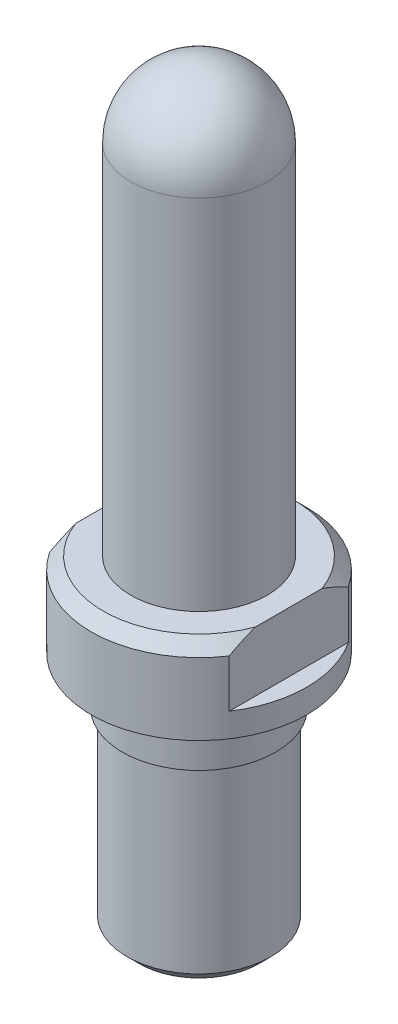
ISO-10303-21;
HEADER;
FILE_DESCRIPTION(('STEP AP214'),'2;1');
FILE_NAME('part.step','',(''),(''),'','','');
FILE_SCHEMA(('AUTOMOTIVE_DESIGN { 1 0 10303 214 1 1 1 1 }'));
ENDSEC;
DATA;
#1=APPLICATION_CONTEXT('core data for automotive mechanical design processes');
#2=APPLICATION_PROTOCOL_DEFINITION('international standard','automotive_design',2000,#1);
#3=PRODUCT_CONTEXT('',#1,'mechanical');
#4=PRODUCT('Part','Part','',(#3));
#5=PRODUCT_RELATED_PRODUCT_CATEGORY('part','',(#4));
#6=PRODUCT_DEFINITION_FORMATION('','',#4);
#7=PRODUCT_DEFINITION_CONTEXT('part definition',#1,'design');
#8=PRODUCT_DEFINITION('design','',#6,#7);
#9=PRODUCT_DEFINITION_SHAPE('','',#8);
#10=(LENGTH_UNIT() NAMED_UNIT(*) SI_UNIT(.MILLI.,.METRE.));
#11=(NAMED_UNIT(*) PLANE_ANGLE_UNIT() SI_UNIT($,.RADIAN.));
#12=(NAMED_UNIT(*) SI_UNIT($,.STERADIAN.) SOLID_ANGLE_UNIT());
#13=UNCERTAINTY_MEASURE_WITH_UNIT(LENGTH_MEASURE(1.E-05),#10,'distance_accuracy_value','');
#14=(GEOMETRIC_REPRESENTATION_CONTEXT(3) GLOBAL_UNCERTAINTY_ASSIGNED_CONTEXT((#13)) GLOBAL_UNIT_ASSIGNED_CONTEXT((#10,
#11,#12)) REPRESENTATION_CONTEXT('',''));
#15=CARTESIAN_POINT('',(0.,0.,0.));
#16=DIRECTION('',(0.,0.,1.));
#17=DIRECTION('',(1.,0.,0.));
#18=AXIS2_PLACEMENT_3D('',#15,#16,#17);
#19=CARTESIAN_POINT('',(2.85,13.5,0.));
#20=DIRECTION('',(0.,1.,0.));
#21=DIRECTION('',(-1.,0.,0.));
#22=AXIS2_PLACEMENT_3D('',#19,#20,#21);
#23=PLANE('',#22);
#24=CARTESIAN_POINT('',(0.,13.5,0.));
#25=DIRECTION('',(0.,-1.,0.));
#26=DIRECTION('',(1.,0.,0.));
#27=AXIS2_PLACEMENT_3D('',#24,#25,#26);
#28=CIRCLE('',#27,2.85);
#29=CARTESIAN_POINT('',(2.85,13.5,0.));
#30=VERTEX_POINT('',#29);
#31=EDGE_CURVE('E217',#30,#30,#28,.T.);
#32=ORIENTED_EDGE('',*,*,#31,.T.);
#33=EDGE_LOOP('',(#32));
#34=FACE_BOUND('',#33,.T.);
#35=CARTESIAN_POINT('',(0.,13.5,0.));
#36=DIRECTION('',(0.,-1.,0.));
#37=DIRECTION('',(1.,0.,0.));
#38=AXIS2_PLACEMENT_3D('',#35,#36,#37);
#39=CIRCLE('',#38,4.);
#40=CARTESIAN_POINT('',(3.75,13.5,1.3919410907075));
#41=VERTEX_POINT('',#40);
#42=CARTESIAN_POINT('',(-3.75,13.5,1.39194109070749));
#43=VERTEX_POINT('',#42);
#44=EDGE_CURVE('E213',#41,#43,#39,.T.);
#45=ORIENTED_EDGE('',*,*,#44,.F.);
#46=DIRECTION('',(0.,0.,-1.));
#47=VECTOR('',#46,1.);
#48=CARTESIAN_POINT('',(3.75,13.5,0.));
#49=LINE('',#48,#47);
#50=CARTESIAN_POINT('',(3.75,13.5,-1.3919410907075));
#51=VERTEX_POINT('',#50);
#52=EDGE_CURVE('E234',#41,#51,#49,.T.);
#53=ORIENTED_EDGE('',*,*,#52,.T.);
#54=CARTESIAN_POINT('',(-3.75,13.5,-1.3919410907075));
#55=VERTEX_POINT('',#54);
#56=EDGE_CURVE('E214',#55,#51,#39,.T.);
#57=ORIENTED_EDGE('',*,*,#56,.F.);
#58=DIRECTION('',(0.,0.,-1.));
#59=VECTOR('',#58,1.);
#60=CARTESIAN_POINT('',(-3.75,13.5,0.));
#61=LINE('',#60,#59);
#62=EDGE_CURVE('E194',#43,#55,#61,.T.);
#63=ORIENTED_EDGE('',*,*,#62,.F.);
#64=EDGE_LOOP('',(#45,#53,#57,#63));
#65=FACE_BOUND('',#64,.T.);
#66=ADVANCED_FACE('F43',(#34,#65),#23,.T.);
#67=CARTESIAN_POINT('',(0.,13.,0.));
#68=DIRECTION('',(0.,-1.,0.));
#69=DIRECTION('',(1.,0.,0.));
#70=AXIS2_PLACEMENT_3D('',#67,#68,#69);
#71=CONICAL_SURFACE('',#70,4.5,0.785398163397448);
#72=CARTESIAN_POINT('',(0.,13.,0.));
#73=DIRECTION('',(0.,-1.,0.));
#74=DIRECTION('',(1.,0.,0.));
#75=AXIS2_PLACEMENT_3D('',#72,#73,#74);
#76=CIRCLE('',#75,4.5);
#77=CARTESIAN_POINT('',(3.75,13.,2.48746859276654));
#78=VERTEX_POINT('',#77);
#79=CARTESIAN_POINT('',(-3.75,13.,2.48746859276654));
#80=VERTEX_POINT('',#79);
#81=EDGE_CURVE('E210',#78,#80,#76,.T.);
#82=ORIENTED_EDGE('',*,*,#81,.F.);
#83=CARTESIAN_POINT('',(3.75,12.9993,2.48873471667833));
#84=CARTESIAN_POINT('',(3.75,13.0361817878737,2.42202912551067));
#85=CARTESIAN_POINT('',(3.75,13.0722813669249,2.35489184848555));
#86=CARTESIAN_POINT('',(3.75,13.1426985759603,2.21966577046416));
#87=CARTESIAN_POINT('',(3.75,13.1770156895048,2.15157670087398));
#88=CARTESIAN_POINT('',(3.75,13.2771910671215,1.94528129073575));
#89=CARTESIAN_POINT('',(3.75,13.3399867655357,1.80555758382075));
#90=CARTESIAN_POINT('',(3.75,13.4555959672474,1.52047067940305));
#91=CARTESIAN_POINT('',(3.75,13.5083110982389,1.37506709026111));
#92=CARTESIAN_POINT('',(3.75,13.6000446020621,1.08014165505694));
#93=CARTESIAN_POINT('',(3.75,13.639084634821,0.930626729815602));
#94=CARTESIAN_POINT('',(3.75,13.6923169926107,0.669057776537484));
#95=CARTESIAN_POINT('',(3.75,13.710372251948,0.557789767388917));
#96=CARTESIAN_POINT('',(3.75,13.7367851685326,0.33407963464614));
#97=CARTESIAN_POINT('',(3.75,13.745142422067,0.221637462369944));
#98=CARTESIAN_POINT('',(3.75,13.7516668167818,-0.00284049045372767));
#99=CARTESIAN_POINT('',(3.75,13.7498975051341,-0.114874400269739));
#100=CARTESIAN_POINT('',(3.75,13.7364216972624,-0.338335407266132));
#101=CARTESIAN_POINT('',(3.75,13.7247145875436,-0.449762466556107));
#102=CARTESIAN_POINT('',(3.75,13.6878776753174,-0.698932729474216));
#103=CARTESIAN_POINT('',(3.75,13.6601231666735,-0.836287951821978));
#104=CARTESIAN_POINT('',(3.75,13.5919991886846,-1.10783345550892));
#105=CARTESIAN_POINT('',(3.75,13.5516230759018,-1.24202202997151));
#106=CARTESIAN_POINT('',(3.75,13.4602797534377,-1.50746827490967));
#107=CARTESIAN_POINT('',(3.75,13.4092586979175,-1.63870713408834));
#108=CARTESIAN_POINT('',(3.75,13.2988722991081,-1.89754675398007));
#109=CARTESIAN_POINT('',(3.75,13.2395092483229,-2.02514850267544));
#110=CARTESIAN_POINT('',(3.75,13.1484498499109,-2.20815164090106));
#111=CARTESIAN_POINT('',(3.75,13.1193746410524,-2.264879932212));
#112=CARTESIAN_POINT('',(3.75,13.0601435688905,-2.37741466162818));
#113=CARTESIAN_POINT('',(3.75,13.0299937111983,-2.43322425806078));
#114=CARTESIAN_POINT('',(3.75,12.9993,-2.48873471667834));
#115=B_SPLINE_CURVE_WITH_KNOTS('',3,(#83,#84,#85,#86,#87,#88,#89,#90,#91,#92,#93,#94,#95,#96,
#97,#98,#99,#100,#101,#102,#103,#104,#105,#106,#107,#108,#109,#110,#111,#112,#113,#114),
.UNSPECIFIED.,.F.,.F.,(4,2,2,2,2,2,2,2,2,2,2,2,2,2,2,4),(0.,0.228658109489232,0.457382103483036,
0.916584890329266,1.38006265677654,1.84280296769301,2.18059459443575,2.51840028241008,
2.85408847417469,3.18979739064798,3.60946579834014,4.02935547337484,4.45142295671228,
4.8733746756542,5.06459957862342,5.25488575630083),.UNSPECIFIED.);
#116=EDGE_CURVE('E98',#78,#41,#115,.T.);
#117=ORIENTED_EDGE('',*,*,#116,.T.);
#118=ORIENTED_EDGE('',*,*,#44,.T.);
#119=CARTESIAN_POINT('',(-3.75,12.9993,2.48873471667833));
#120=CARTESIAN_POINT('',(-3.75,13.0361817878737,2.42202912551067));
#121=CARTESIAN_POINT('',(-3.75,13.0722813669249,2.35489184848555));
#122=CARTESIAN_POINT('',(-3.75,13.1426985759603,2.21966577046416));
#123=CARTESIAN_POINT('',(-3.75,13.1770156895048,2.15157670087398));
#124=CARTESIAN_POINT('',(-3.75,13.2771910671215,1.94528129073575));
#125=CARTESIAN_POINT('',(-3.75,13.3399867655357,1.80555758382075));
#126=CARTESIAN_POINT('',(-3.75,13.4555959672474,1.52047067940305));
#127=CARTESIAN_POINT('',(-3.75,13.5083110982389,1.37506709026111));
#128=CARTESIAN_POINT('',(-3.75,13.6000446020621,1.08014165505694));
#129=CARTESIAN_POINT('',(-3.75,13.639084634821,0.930626729815602));
#130=CARTESIAN_POINT('',(-3.75,13.6923169926107,0.669057776537484));
#131=CARTESIAN_POINT('',(-3.75,13.710372251948,0.557789767388917));
#132=CARTESIAN_POINT('',(-3.75,13.7367851685326,0.33407963464614));
#133=CARTESIAN_POINT('',(-3.75,13.745142422067,0.221637462369944));
#134=CARTESIAN_POINT('',(-3.75,13.7516668167818,-0.00284049045372767));
#135=CARTESIAN_POINT('',(-3.75,13.7498975051341,-0.114874400269739));
#136=CARTESIAN_POINT('',(-3.75,13.7364216972624,-0.338335407266132));
#137=CARTESIAN_POINT('',(-3.75,13.7247145875436,-0.449762466556107));
#138=CARTESIAN_POINT('',(-3.75,13.6878776753174,-0.698932729474216));
#139=CARTESIAN_POINT('',(-3.75,13.6601231666735,-0.836287951821978));
#140=CARTESIAN_POINT('',(-3.75,13.5919991886846,-1.10783345550892));
#141=CARTESIAN_POINT('',(-3.75,13.5516230759018,-1.24202202997151));
#142=CARTESIAN_POINT('',(-3.75,13.4602797534377,-1.50746827490967));
#143=CARTESIAN_POINT('',(-3.75,13.4092586979175,-1.63870713408834));
#144=CARTESIAN_POINT('',(-3.75,13.2988722991081,-1.89754675398007));
#145=CARTESIAN_POINT('',(-3.75,13.2395092483229,-2.02514850267544));
#146=CARTESIAN_POINT('',(-3.75,13.1484498499109,-2.20815164090106));
#147=CARTESIAN_POINT('',(-3.75,13.1193746410524,-2.264879932212));
#148=CARTESIAN_POINT('',(-3.75,13.0601435688905,-2.37741466162818));
#149=CARTESIAN_POINT('',(-3.75,13.0299937111983,-2.43322425806078));
#150=CARTESIAN_POINT('',(-3.75,12.9993,-2.48873471667834));
#151=B_SPLINE_CURVE_WITH_KNOTS('',3,(#119,#120,#121,#122,#123,#124,#125,#126,#127,#128,#129,
#130,#131,#132,#133,#134,#135,#136,#137,#138,#139,#140,#141,#142,#143,#144,#145,#146,#147,#148,
#149,#150),.UNSPECIFIED.,.F.,.F.,(4,2,2,2,2,2,2,2,2,2,2,2,2,2,2,4),(0.,0.228658109489232,
0.457382103483036,0.916584890329266,1.38006265677654,1.84280296769301,2.18059459443575,
2.51840028241008,2.85408847417469,3.18979739064798,3.60946579834014,4.02935547337484,
4.45142295671228,4.8733746756542,5.06459957862342,5.25488575630083),.UNSPECIFIED.);
#152=EDGE_CURVE('E195',#80,#43,#151,.T.);
#153=ORIENTED_EDGE('',*,*,#152,.F.);
#154=EDGE_LOOP('',(#82,#117,#118,#153));
#155=FACE_BOUND('',#154,.T.);
#156=ADVANCED_FACE('F129',(#155),#71,.T.);
#157=ORIENTED_EDGE('',*,*,#56,.T.);
#158=CARTESIAN_POINT('',(3.75,13.,-2.48746859276655));
#159=VERTEX_POINT('',#158);
#160=EDGE_CURVE('E107',#51,#159,#115,.T.);
#161=ORIENTED_EDGE('',*,*,#160,.T.);
#162=CARTESIAN_POINT('',(-3.75,13.,-2.48746859276655));
#163=VERTEX_POINT('',#162);
#164=EDGE_CURVE('E211',#163,#159,#76,.T.);
#165=ORIENTED_EDGE('',*,*,#164,.F.);
#166=EDGE_CURVE('E187',#55,#163,#151,.T.);
#167=ORIENTED_EDGE('',*,*,#166,.F.);
#168=EDGE_LOOP('',(#157,#161,#165,#167));
#169=FACE_BOUND('',#168,.T.);
#170=ADVANCED_FACE('F135',(#169),#71,.T.);
#171=CARTESIAN_POINT('',(0.,0.,0.));
#172=DIRECTION('',(0.,-1.,0.));
#173=DIRECTION('',(1.,0.,0.));
#174=AXIS2_PLACEMENT_3D('',#171,#172,#173);
#175=CYLINDRICAL_SURFACE('',#174,4.5);
#176=CARTESIAN_POINT('',(0.,10.,0.));
#177=DIRECTION('',(0.,-1.,0.));
#178=DIRECTION('',(1.,0.,0.));
#179=AXIS2_PLACEMENT_3D('',#176,#177,#178);
#180=CIRCLE('',#179,4.5);
#181=CARTESIAN_POINT('',(4.5,10.,0.));
#182=VERTEX_POINT('',#181);
#183=EDGE_CURVE('E207',#182,#182,#180,.T.);
#184=ORIENTED_EDGE('',*,*,#183,.F.);
#185=EDGE_LOOP('',(#184));
#186=FACE_BOUND('',#185,.T.);
#187=CARTESIAN_POINT('',(0.,11.,0.));
#188=DIRECTION('',(0.,1.,0.));
#189=DIRECTION('',(0.,0.,1.));
#190=AXIS2_PLACEMENT_3D('',#187,#188,#189);
#191=CIRCLE('',#190,4.5);
#192=CARTESIAN_POINT('',(3.75,11.,-2.48746859276655));
#193=VERTEX_POINT('',#192);
#194=CARTESIAN_POINT('',(3.75,11.,2.48746859276655));
#195=VERTEX_POINT('',#194);
#196=EDGE_CURVE('E102',#193,#195,#191,.F.);
#197=ORIENTED_EDGE('',*,*,#196,.T.);
#198=DIRECTION('',(0.,-1.,0.));
#199=VECTOR('',#198,1.);
#200=CARTESIAN_POINT('',(3.75,0.,2.48746859276655));
#201=LINE('',#200,#199);
#202=EDGE_CURVE('E95',#195,#78,#201,.F.);
#203=ORIENTED_EDGE('',*,*,#202,.T.);
#204=ORIENTED_EDGE('',*,*,#81,.T.);
#205=DIRECTION('',(0.,-1.,0.));
#206=VECTOR('',#205,1.);
#207=CARTESIAN_POINT('',(-3.75,0.,2.48746859276655));
#208=LINE('',#207,#206);
#209=CARTESIAN_POINT('',(-3.75,11.,2.48746859276655));
#210=VERTEX_POINT('',#209);
#211=EDGE_CURVE('E113',#210,#80,#208,.F.);
#212=ORIENTED_EDGE('',*,*,#211,.F.);
#213=CARTESIAN_POINT('',(0.,11.,0.));
#214=DIRECTION('',(0.,-1.,0.));
#215=DIRECTION('',(0.,0.,-1.));
#216=AXIS2_PLACEMENT_3D('',#213,#214,#215);
#217=CIRCLE('',#216,4.5);
#218=CARTESIAN_POINT('',(-3.75,11.,-2.48746859276655));
#219=VERTEX_POINT('',#218);
#220=EDGE_CURVE('E222',#219,#210,#217,.F.);
#221=ORIENTED_EDGE('',*,*,#220,.F.);
#222=DIRECTION('',(0.,-1.,0.));
#223=VECTOR('',#222,1.);
#224=CARTESIAN_POINT('',(-3.75,0.,-2.48746859276655));
#225=LINE('',#224,#223);
#226=EDGE_CURVE('E224',#163,#219,#225,.T.);
#227=ORIENTED_EDGE('',*,*,#226,.F.);
#228=ORIENTED_EDGE('',*,*,#164,.T.);
#229=DIRECTION('',(0.,-1.,0.));
#230=VECTOR('',#229,1.);
#231=CARTESIAN_POINT('',(3.75,0.,-2.48746859276655));
#232=LINE('',#231,#230);
#233=EDGE_CURVE('E111',#159,#193,#232,.T.);
#234=ORIENTED_EDGE('',*,*,#233,.T.);
#235=EDGE_LOOP('',(#197,#203,#204,#212,#221,#227,#228,#234));
#236=FACE_BOUND('',#235,.T.);
#237=ADVANCED_FACE('F109',(#186,#236),#175,.T.);
#238=CARTESIAN_POINT('',(3.,0.,0.));
#239=DIRECTION('',(0.,-1.,0.));
#240=DIRECTION('',(1.,0.,0.));
#241=AXIS2_PLACEMENT_3D('',#238,#239,#240);
#242=PLANE('',#241);
#243=CARTESIAN_POINT('',(0.,0.,0.));
#244=DIRECTION('',(0.,-1.,0.));
#245=DIRECTION('',(1.,0.,0.));
#246=AXIS2_PLACEMENT_3D('',#243,#244,#245);
#247=CIRCLE('',#246,2.5);
#248=CARTESIAN_POINT('',(2.5,0.,0.));
#249=VERTEX_POINT('',#248);
#250=EDGE_CURVE('E52',#249,#249,#247,.T.);
#251=ORIENTED_EDGE('',*,*,#250,.T.);
#252=EDGE_LOOP('',(#251));
#253=FACE_BOUND('',#252,.T.);
#254=ADVANCED_FACE('F119',(#253),#242,.T.);
#255=CARTESIAN_POINT('',(0.,28.45,0.));
#256=DIRECTION('',(0.,-1.,0.));
#257=DIRECTION('',(1.,0.,0.));
#258=AXIS2_PLACEMENT_3D('',#255,#256,#257);
#259=SPHERICAL_SURFACE('',#258,2.85);
#260=CARTESIAN_POINT('',(0.,28.45,0.));
#261=DIRECTION('',(0.,-1.,0.));
#262=DIRECTION('',(1.,0.,0.));
#263=AXIS2_PLACEMENT_3D('',#260,#261,#262);
#264=CIRCLE('',#263,2.85);
#265=CARTESIAN_POINT('',(2.85,28.45,0.));
#266=VERTEX_POINT('',#265);
#267=EDGE_CURVE('E219',#266,#266,#264,.T.);
#268=ORIENTED_EDGE('',*,*,#267,.F.);
#269=EDGE_LOOP('',(#268));
#270=FACE_BOUND('',#269,.T.);
#271=ADVANCED_FACE('F147',(#270),#259,.T.);
#272=CARTESIAN_POINT('',(0.,0.,0.));
#273=DIRECTION('',(0.,-1.,0.));
#274=DIRECTION('',(1.,0.,0.));
#275=AXIS2_PLACEMENT_3D('',#272,#273,#274);
#276=CYLINDRICAL_SURFACE('',#275,2.85);
#277=ORIENTED_EDGE('',*,*,#267,.T.);
#278=EDGE_LOOP('',(#277));
#279=FACE_BOUND('',#278,.T.);
#280=ORIENTED_EDGE('',*,*,#31,.F.);
#281=EDGE_LOOP('',(#280));
#282=FACE_BOUND('',#281,.T.);
#283=ADVANCED_FACE('F143',(#279,#282),#276,.T.);
#284=CARTESIAN_POINT('',(4.5,10.,0.));
#285=DIRECTION('',(0.,-1.,0.));
#286=DIRECTION('',(1.,0.,0.));
#287=AXIS2_PLACEMENT_3D('',#284,#285,#286);
#288=PLANE('',#287);
#289=ORIENTED_EDGE('',*,*,#183,.T.);
#290=EDGE_LOOP('',(#289));
#291=FACE_BOUND('',#290,.T.);
#292=CARTESIAN_POINT('',(0.,10.,0.));
#293=DIRECTION('',(0.,-1.,0.));
#294=DIRECTION('',(1.,0.,0.));
#295=AXIS2_PLACEMENT_3D('',#292,#293,#294);
#296=CIRCLE('',#295,3.2);
#297=CARTESIAN_POINT('',(3.2,10.,0.));
#298=VERTEX_POINT('',#297);
#299=EDGE_CURVE('E204',#298,#298,#296,.T.);
#300=ORIENTED_EDGE('',*,*,#299,.F.);
#301=EDGE_LOOP('',(#300));
#302=FACE_BOUND('',#301,.T.);
#303=ADVANCED_FACE('F146',(#291,#302),#288,.T.);
#304=CARTESIAN_POINT('',(0.,0.,0.));
#305=DIRECTION('',(0.,-1.,0.));
#306=DIRECTION('',(1.,0.,0.));
#307=AXIS2_PLACEMENT_3D('',#304,#305,#306);
#308=CYLINDRICAL_SURFACE('',#307,3.2);
#309=ORIENTED_EDGE('',*,*,#299,.T.);
#310=EDGE_LOOP('',(#309));
#311=FACE_BOUND('',#310,.T.);
#312=CARTESIAN_POINT('',(0.,8.,0.));
#313=DIRECTION('',(0.,-1.,0.));
#314=DIRECTION('',(1.,0.,0.));
#315=AXIS2_PLACEMENT_3D('',#312,#313,#314);
#316=CIRCLE('',#315,3.2);
#317=CARTESIAN_POINT('',(3.2,8.,0.));
#318=VERTEX_POINT('',#317);
#319=EDGE_CURVE('E201',#318,#318,#316,.T.);
#320=ORIENTED_EDGE('',*,*,#319,.F.);
#321=EDGE_LOOP('',(#320));
#322=FACE_BOUND('',#321,.T.);
#323=ADVANCED_FACE('F164',(#311,#322),#308,.T.);
#324=CARTESIAN_POINT('',(3.,8.,0.));
#325=DIRECTION('',(0.,-1.,0.));
#326=DIRECTION('',(1.,0.,0.));
#327=AXIS2_PLACEMENT_3D('',#324,#325,#326);
#328=PLANE('',#327);
#329=ORIENTED_EDGE('',*,*,#319,.T.);
#330=EDGE_LOOP('',(#329));
#331=FACE_BOUND('',#330,.T.);
#332=CARTESIAN_POINT('',(0.,8.,0.));
#333=DIRECTION('',(0.,-1.,0.));
#334=DIRECTION('',(1.,0.,0.));
#335=AXIS2_PLACEMENT_3D('',#332,#333,#334);
#336=CIRCLE('',#335,3.);
#337=CARTESIAN_POINT('',(3.,8.,0.));
#338=VERTEX_POINT('',#337);
#339=EDGE_CURVE('E198',#338,#338,#336,.T.);
#340=ORIENTED_EDGE('',*,*,#339,.F.);
#341=EDGE_LOOP('',(#340));
#342=FACE_BOUND('',#341,.T.);
#343=ADVANCED_FACE('F168',(#331,#342),#328,.T.);
#344=CARTESIAN_POINT('',(0.,0.,0.));
#345=DIRECTION('',(0.,-1.,0.));
#346=DIRECTION('',(1.,0.,0.));
#347=AXIS2_PLACEMENT_3D('',#344,#345,#346);
#348=CYLINDRICAL_SURFACE('',#347,3.);
#349=CARTESIAN_POINT('',(0.,0.500000000000002,0.));
#350=DIRECTION('',(0.,-1.,0.));
#351=DIRECTION('',(1.,0.,0.));
#352=AXIS2_PLACEMENT_3D('',#349,#350,#351);
#353=CIRCLE('',#352,3.);
#354=CARTESIAN_POINT('',(3.,0.500000000000002,0.));
#355=VERTEX_POINT('',#354);
#356=EDGE_CURVE('E12',#355,#355,#353,.F.);
#357=ORIENTED_EDGE('',*,*,#356,.T.);
#358=EDGE_LOOP('',(#357));
#359=FACE_BOUND('',#358,.T.);
#360=ORIENTED_EDGE('',*,*,#339,.T.);
#361=EDGE_LOOP('',(#360));
#362=FACE_BOUND('',#361,.T.);
#363=ADVANCED_FACE('F172',(#359,#362),#348,.T.);
#364=CARTESIAN_POINT('',(-3.75,14.,-4.5));
#365=DIRECTION('',(1.,0.,0.));
#366=DIRECTION('',(0.,1.,0.));
#367=AXIS2_PLACEMENT_3D('',#364,#365,#366);
#368=PLANE('',#367);
#369=ORIENTED_EDGE('',*,*,#211,.T.);
#370=ORIENTED_EDGE('',*,*,#152,.T.);
#371=ORIENTED_EDGE('',*,*,#62,.T.);
#372=ORIENTED_EDGE('',*,*,#166,.T.);
#373=ORIENTED_EDGE('',*,*,#226,.T.);
#374=DIRECTION('',(0.,0.,1.));
#375=VECTOR('',#374,1.);
#376=CARTESIAN_POINT('',(-3.75,11.,-4.5));
#377=LINE('',#376,#375);
#378=EDGE_CURVE('E66',#219,#210,#377,.T.);
#379=ORIENTED_EDGE('',*,*,#378,.T.);
#380=EDGE_LOOP('',(#369,#370,#371,#372,#373,#379));
#381=FACE_BOUND('',#380,.T.);
#382=ADVANCED_FACE('F176',(#381),#368,.F.);
#383=CARTESIAN_POINT('',(-5.75,11.,-4.5));
#384=DIRECTION('',(0.,-1.,0.));
#385=DIRECTION('',(0.,0.,-1.));
#386=AXIS2_PLACEMENT_3D('',#383,#384,#385);
#387=PLANE('',#386);
#388=ORIENTED_EDGE('',*,*,#220,.T.);
#389=ORIENTED_EDGE('',*,*,#378,.F.);
#390=EDGE_LOOP('',(#388,#389));
#391=FACE_BOUND('',#390,.T.);
#392=ADVANCED_FACE('F178',(#391),#387,.F.);
#393=CARTESIAN_POINT('',(5.75,11.,-4.5));
#394=DIRECTION('',(0.,1.,0.));
#395=DIRECTION('',(0.,0.,1.));
#396=AXIS2_PLACEMENT_3D('',#393,#394,#395);
#397=PLANE('',#396);
#398=DIRECTION('',(0.,0.,1.));
#399=VECTOR('',#398,1.);
#400=CARTESIAN_POINT('',(3.75,11.,-4.5));
#401=LINE('',#400,#399);
#402=EDGE_CURVE('E59',#193,#195,#401,.T.);
#403=ORIENTED_EDGE('',*,*,#402,.T.);
#404=ORIENTED_EDGE('',*,*,#196,.F.);
#405=EDGE_LOOP('',(#403,#404));
#406=FACE_BOUND('',#405,.T.);
#407=ADVANCED_FACE('F105',(#406),#397,.T.);
#408=CARTESIAN_POINT('',(3.75,14.,-4.5));
#409=DIRECTION('',(1.,0.,0.));
#410=DIRECTION('',(0.,1.,0.));
#411=AXIS2_PLACEMENT_3D('',#408,#409,#410);
#412=PLANE('',#411);
#413=ORIENTED_EDGE('',*,*,#402,.F.);
#414=ORIENTED_EDGE('',*,*,#233,.F.);
#415=ORIENTED_EDGE('',*,*,#160,.F.);
#416=ORIENTED_EDGE('',*,*,#52,.F.);
#417=ORIENTED_EDGE('',*,*,#116,.F.);
#418=ORIENTED_EDGE('',*,*,#202,.F.);
#419=EDGE_LOOP('',(#413,#414,#415,#416,#417,#418));
#420=FACE_BOUND('',#419,.T.);
#421=ADVANCED_FACE('F96',(#420),#412,.T.);
#422=CARTESIAN_POINT('',(0.,0.,0.));
#423=DIRECTION('',(0.,1.,0.));
#424=DIRECTION('',(-1.,0.,0.));
#425=AXIS2_PLACEMENT_3D('',#422,#423,#424);
#426=CONICAL_SURFACE('',#425,2.5,0.785398163397445);
#427=ORIENTED_EDGE('',*,*,#356,.F.);
#428=EDGE_LOOP('',(#427));
#429=FACE_BOUND('',#428,.T.);
#430=ORIENTED_EDGE('',*,*,#250,.F.);
#431=EDGE_LOOP('',(#430));
#432=FACE_BOUND('',#431,.T.);
#433=ADVANCED_FACE('F46',(#429,#432),#426,.T.);
#434=CLOSED_SHELL('',(#66,#156,#170,#237,#254,#271,#283,#303,#323,#343,#363,#382,#392,#407,#421,#433));
#435=MANIFOLD_SOLID_BREP('B2',#434);
#436=ADVANCED_BREP_SHAPE_REPRESENTATION('',(#18,#435),#14);
#437=SHAPE_DEFINITION_REPRESENTATION(#9,#436);
ENDSEC;
END-ISO-10303-21;
